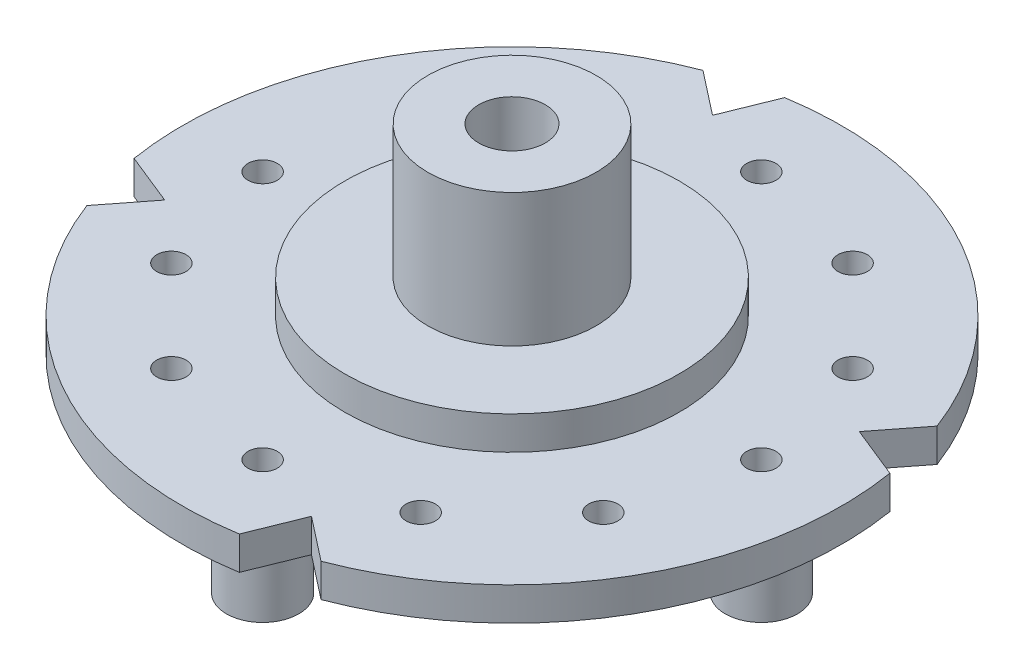
ISO-10303-21;
HEADER;
FILE_DESCRIPTION(('STEP AP214'),'2;1');
FILE_NAME('part.step','',(''),(''),'','','');
FILE_SCHEMA(('AUTOMOTIVE_DESIGN { 1 0 10303 214 1 1 1 1 }'));
ENDSEC;
DATA;
#1=APPLICATION_CONTEXT('core data for automotive mechanical design processes');
#2=APPLICATION_PROTOCOL_DEFINITION('international standard','automotive_design',2000,#1);
#3=PRODUCT_CONTEXT('',#1,'mechanical');
#4=PRODUCT('Part','Part','',(#3));
#5=PRODUCT_RELATED_PRODUCT_CATEGORY('part','',(#4));
#6=PRODUCT_DEFINITION_FORMATION('','',#4);
#7=PRODUCT_DEFINITION_CONTEXT('part definition',#1,'design');
#8=PRODUCT_DEFINITION('design','',#6,#7);
#9=PRODUCT_DEFINITION_SHAPE('','',#8);
#10=(LENGTH_UNIT() NAMED_UNIT(*) SI_UNIT(.MILLI.,.METRE.));
#11=(NAMED_UNIT(*) PLANE_ANGLE_UNIT() SI_UNIT($,.RADIAN.));
#12=(NAMED_UNIT(*) SI_UNIT($,.STERADIAN.) SOLID_ANGLE_UNIT());
#13=UNCERTAINTY_MEASURE_WITH_UNIT(LENGTH_MEASURE(1.E-05),#10,'distance_accuracy_value','');
#14=(GEOMETRIC_REPRESENTATION_CONTEXT(3) GLOBAL_UNCERTAINTY_ASSIGNED_CONTEXT((#13)) GLOBAL_UNIT_ASSIGNED_CONTEXT((#10,
#11,#12)) REPRESENTATION_CONTEXT('',''));
#15=CARTESIAN_POINT('',(0.,0.,0.));
#16=DIRECTION('',(0.,0.,1.));
#17=DIRECTION('',(1.,0.,0.));
#18=AXIS2_PLACEMENT_3D('',#15,#16,#17);
#19=CARTESIAN_POINT('',(0.,25.908,0.));
#20=DIRECTION('',(0.,1.,0.));
#21=DIRECTION('',(0.,0.,1.));
#22=AXIS2_PLACEMENT_3D('',#19,#20,#21);
#23=CYLINDRICAL_SURFACE('',#22,42.799);
#24=CARTESIAN_POINT('',(0.,4.318,0.));
#25=DIRECTION('',(0.,1.,0.));
#26=DIRECTION('',(0.,0.,1.));
#27=AXIS2_PLACEMENT_3D('',#24,#25,#26);
#28=CIRCLE('',#27,42.799);
#29=CARTESIAN_POINT('',(-40.0070336083831,4.318,15.2049880913371));
#30=VERTEX_POINT('',#29);
#31=CARTESIAN_POINT('',(6.83561085285415,4.318,42.2496014805861));
#32=VERTEX_POINT('',#31);
#33=EDGE_CURVE('E273',#30,#32,#28,.T.);
#34=ORIENTED_EDGE('',*,*,#33,.F.);
#35=DIRECTION('',(0.,-1.,0.));
#36=VECTOR('',#35,1.);
#37=CARTESIAN_POINT('',(-40.0070336083831,25.908,15.2049880913371));
#38=LINE('',#37,#36);
#39=CARTESIAN_POINT('',(-40.0070336083831,0.,15.2049880913371));
#40=VERTEX_POINT('',#39);
#41=EDGE_CURVE('E135',#30,#40,#38,.T.);
#42=ORIENTED_EDGE('',*,*,#41,.T.);
#43=CARTESIAN_POINT('',(0.,0.,0.));
#44=DIRECTION('',(0.,1.,0.));
#45=DIRECTION('',(0.,0.,1.));
#46=AXIS2_PLACEMENT_3D('',#43,#44,#45);
#47=CIRCLE('',#46,42.799);
#48=CARTESIAN_POINT('',(6.83561085285415,0.,42.2496014805861));
#49=VERTEX_POINT('',#48);
#50=EDGE_CURVE('E147',#40,#49,#47,.T.);
#51=ORIENTED_EDGE('',*,*,#50,.T.);
#52=DIRECTION('',(0.,-1.,0.));
#53=VECTOR('',#52,1.);
#54=CARTESIAN_POINT('',(6.83561085285415,25.908,42.2496014805861));
#55=LINE('',#54,#53);
#56=EDGE_CURVE('E142',#32,#49,#55,.T.);
#57=ORIENTED_EDGE('',*,*,#56,.F.);
#58=EDGE_LOOP('',(#34,#42,#51,#57));
#59=FACE_BOUND('',#58,.T.);
#60=ADVANCED_FACE('F35',(#59),#23,.T.);
#61=CARTESIAN_POINT('',(-15.2049880913371,0.,-40.0070336083831));
#62=VERTEX_POINT('',#61);
#63=CARTESIAN_POINT('',(-42.2496014805861,0.,6.83561085285415));
#64=VERTEX_POINT('',#63);
#65=EDGE_CURVE('E271',#62,#64,#47,.T.);
#66=ORIENTED_EDGE('',*,*,#65,.T.);
#67=DIRECTION('',(0.,-1.,0.));
#68=VECTOR('',#67,1.);
#69=CARTESIAN_POINT('',(-42.2496014805861,25.908,6.83561085285414));
#70=LINE('',#69,#68);
#71=CARTESIAN_POINT('',(-42.2496014805861,4.318,6.83561085285414));
#72=VERTEX_POINT('',#71);
#73=EDGE_CURVE('E60',#72,#64,#70,.T.);
#74=ORIENTED_EDGE('',*,*,#73,.F.);
#75=CARTESIAN_POINT('',(-15.2049880913371,4.318,-40.0070336083831));
#76=VERTEX_POINT('',#75);
#77=EDGE_CURVE('E276',#76,#72,#28,.T.);
#78=ORIENTED_EDGE('',*,*,#77,.F.);
#79=DIRECTION('',(0.,-1.,0.));
#80=VECTOR('',#79,1.);
#81=CARTESIAN_POINT('',(-15.2049880913371,25.908,-40.0070336083831));
#82=LINE('',#81,#80);
#83=EDGE_CURVE('E167',#76,#62,#82,.T.);
#84=ORIENTED_EDGE('',*,*,#83,.T.);
#85=EDGE_LOOP('',(#66,#74,#78,#84));
#86=FACE_BOUND('',#85,.T.);
#87=ADVANCED_FACE('F343',(#86),#23,.T.);
#88=CARTESIAN_POINT('',(40.0070336083831,4.318,-15.2049880913371));
#89=VERTEX_POINT('',#88);
#90=CARTESIAN_POINT('',(-6.83561085285415,4.318,-42.2496014805861));
#91=VERTEX_POINT('',#90);
#92=EDGE_CURVE('E376',#89,#91,#28,.T.);
#93=ORIENTED_EDGE('',*,*,#92,.F.);
#94=DIRECTION('',(0.,-1.,0.));
#95=VECTOR('',#94,1.);
#96=CARTESIAN_POINT('',(40.0070336083831,25.908,-15.2049880913371));
#97=LINE('',#96,#95);
#98=CARTESIAN_POINT('',(40.0070336083831,0.,-15.2049880913371));
#99=VERTEX_POINT('',#98);
#100=EDGE_CURVE('E155',#89,#99,#97,.T.);
#101=ORIENTED_EDGE('',*,*,#100,.T.);
#102=CARTESIAN_POINT('',(-6.83561085285415,0.,-42.2496014805861));
#103=VERTEX_POINT('',#102);
#104=EDGE_CURVE('E384',#99,#103,#47,.T.);
#105=ORIENTED_EDGE('',*,*,#104,.T.);
#106=DIRECTION('',(0.,-1.,0.));
#107=VECTOR('',#106,1.);
#108=CARTESIAN_POINT('',(-6.83561085285415,25.908,-42.2496014805861));
#109=LINE('',#108,#107);
#110=EDGE_CURVE('E180',#91,#103,#109,.T.);
#111=ORIENTED_EDGE('',*,*,#110,.F.);
#112=EDGE_LOOP('',(#93,#101,#105,#111));
#113=FACE_BOUND('',#112,.T.);
#114=ADVANCED_FACE('F350',(#113),#23,.T.);
#115=CARTESIAN_POINT('',(0.,25.908,0.));
#116=DIRECTION('',(0.,1.,0.));
#117=DIRECTION('',(0.,0.,1.));
#118=AXIS2_PLACEMENT_3D('',#115,#116,#117);
#119=CYLINDRICAL_SURFACE('',#118,4.318);
#120=CARTESIAN_POINT('',(0.,4.572,0.));
#121=DIRECTION('',(0.,1.,0.));
#122=DIRECTION('',(0.,0.,1.));
#123=AXIS2_PLACEMENT_3D('',#120,#121,#122);
#124=CIRCLE('',#123,4.318);
#125=CARTESIAN_POINT('',(0.,4.572,4.318));
#126=VERTEX_POINT('',#125);
#127=EDGE_CURVE('E267',#126,#126,#124,.T.);
#128=ORIENTED_EDGE('',*,*,#127,.F.);
#129=EDGE_LOOP('',(#128));
#130=FACE_BOUND('',#129,.T.);
#131=CARTESIAN_POINT('',(0.,25.908,0.));
#132=DIRECTION('',(0.,1.,0.));
#133=DIRECTION('',(0.,0.,1.));
#134=AXIS2_PLACEMENT_3D('',#131,#132,#133);
#135=CIRCLE('',#134,4.318);
#136=CARTESIAN_POINT('',(0.,25.908,4.318));
#137=VERTEX_POINT('',#136);
#138=EDGE_CURVE('E290',#137,#137,#135,.T.);
#139=ORIENTED_EDGE('',*,*,#138,.T.);
#140=EDGE_LOOP('',(#139));
#141=FACE_BOUND('',#140,.T.);
#142=ADVANCED_FACE('F37',(#130,#141),#119,.F.);
#143=CARTESIAN_POINT('',(0.,25.908,0.));
#144=DIRECTION('',(0.,-1.,0.));
#145=DIRECTION('',(0.,0.,-1.));
#146=AXIS2_PLACEMENT_3D('',#143,#144,#145);
#147=PLANE('',#146);
#148=ORIENTED_EDGE('',*,*,#138,.F.);
#149=EDGE_LOOP('',(#148));
#150=FACE_BOUND('',#149,.T.);
#151=CARTESIAN_POINT('',(0.,25.908,0.));
#152=DIRECTION('',(0.,1.,0.));
#153=DIRECTION('',(0.,0.,1.));
#154=AXIS2_PLACEMENT_3D('',#151,#152,#153);
#155=CIRCLE('',#154,10.922);
#156=CARTESIAN_POINT('',(0.,25.908,10.922));
#157=VERTEX_POINT('',#156);
#158=EDGE_CURVE('E287',#157,#157,#155,.T.);
#159=ORIENTED_EDGE('',*,*,#158,.T.);
#160=EDGE_LOOP('',(#159));
#161=FACE_BOUND('',#160,.T.);
#162=ADVANCED_FACE('F371',(#150,#161),#147,.F.);
#163=CARTESIAN_POINT('',(0.,25.908,0.));
#164=DIRECTION('',(0.,1.,0.));
#165=DIRECTION('',(0.,0.,1.));
#166=AXIS2_PLACEMENT_3D('',#163,#164,#165);
#167=CYLINDRICAL_SURFACE('',#166,10.922);
#168=ORIENTED_EDGE('',*,*,#158,.F.);
#169=EDGE_LOOP('',(#168));
#170=FACE_BOUND('',#169,.T.);
#171=CARTESIAN_POINT('',(0.,8.63599999999999,0.));
#172=DIRECTION('',(0.,1.,0.));
#173=DIRECTION('',(0.,0.,1.));
#174=AXIS2_PLACEMENT_3D('',#171,#172,#173);
#175=CIRCLE('',#174,10.922);
#176=CARTESIAN_POINT('',(0.,8.63599999999999,10.922));
#177=VERTEX_POINT('',#176);
#178=EDGE_CURVE('E284',#177,#177,#175,.T.);
#179=ORIENTED_EDGE('',*,*,#178,.T.);
#180=EDGE_LOOP('',(#179));
#181=FACE_BOUND('',#180,.T.);
#182=ADVANCED_FACE('F465',(#170,#181),#167,.T.);
#183=CARTESIAN_POINT('',(0.,8.63599999999999,0.));
#184=DIRECTION('',(0.,-1.,0.));
#185=DIRECTION('',(0.,0.,-1.));
#186=AXIS2_PLACEMENT_3D('',#183,#184,#185);
#187=PLANE('',#186);
#188=ORIENTED_EDGE('',*,*,#178,.F.);
#189=EDGE_LOOP('',(#188));
#190=FACE_BOUND('',#189,.T.);
#191=CARTESIAN_POINT('',(0.,8.63599999999999,0.));
#192=DIRECTION('',(0.,1.,0.));
#193=DIRECTION('',(0.,0.,1.));
#194=AXIS2_PLACEMENT_3D('',#191,#192,#193);
#195=CIRCLE('',#194,21.717);
#196=CARTESIAN_POINT('',(0.,8.63599999999999,21.717));
#197=VERTEX_POINT('',#196);
#198=EDGE_CURVE('E281',#197,#197,#195,.T.);
#199=ORIENTED_EDGE('',*,*,#198,.T.);
#200=EDGE_LOOP('',(#199));
#201=FACE_BOUND('',#200,.T.);
#202=ADVANCED_FACE('F459',(#190,#201),#187,.F.);
#203=CARTESIAN_POINT('',(0.,25.908,0.));
#204=DIRECTION('',(0.,1.,0.));
#205=DIRECTION('',(0.,0.,1.));
#206=AXIS2_PLACEMENT_3D('',#203,#204,#205);
#207=CYLINDRICAL_SURFACE('',#206,21.717);
#208=ORIENTED_EDGE('',*,*,#198,.F.);
#209=EDGE_LOOP('',(#208));
#210=FACE_BOUND('',#209,.T.);
#211=CARTESIAN_POINT('',(0.,4.318,0.));
#212=DIRECTION('',(0.,1.,0.));
#213=DIRECTION('',(0.,0.,1.));
#214=AXIS2_PLACEMENT_3D('',#211,#212,#213);
#215=CIRCLE('',#214,21.717);
#216=CARTESIAN_POINT('',(0.,4.318,21.717));
#217=VERTEX_POINT('',#216);
#218=EDGE_CURVE('E278',#217,#217,#215,.T.);
#219=ORIENTED_EDGE('',*,*,#218,.T.);
#220=EDGE_LOOP('',(#219));
#221=FACE_BOUND('',#220,.T.);
#222=ADVANCED_FACE('F363',(#210,#221),#207,.T.);
#223=CARTESIAN_POINT('',(0.,4.318,0.));
#224=DIRECTION('',(0.,-1.,0.));
#225=DIRECTION('',(0.,0.,-1.));
#226=AXIS2_PLACEMENT_3D('',#223,#224,#225);
#227=PLANE('',#226);
#228=CARTESIAN_POINT('',(-32.385,4.318,0.));
#229=DIRECTION('',(0.,1.,0.));
#230=DIRECTION('',(0.,0.,1.));
#231=AXIS2_PLACEMENT_3D('',#228,#229,#230);
#232=CIRCLE('',#231,1.905);
#233=CARTESIAN_POINT('',(-32.385,4.318,1.905));
#234=VERTEX_POINT('',#233);
#235=EDGE_CURVE('E211',#234,#234,#232,.T.);
#236=ORIENTED_EDGE('',*,*,#235,.F.);
#237=EDGE_LOOP('',(#236));
#238=FACE_BOUND('',#237,.T.);
#239=CARTESIAN_POINT('',(-28.046232701559,4.318,16.1925000000002));
#240=DIRECTION('',(0.,1.,0.));
#241=DIRECTION('',(0.,0.,1.));
#242=AXIS2_PLACEMENT_3D('',#239,#240,#241);
#243=CIRCLE('',#242,1.90499999999977);
#244=CARTESIAN_POINT('',(-28.046232701559,4.318,18.0975));
#245=VERTEX_POINT('',#244);
#246=EDGE_CURVE('E206',#245,#245,#243,.T.);
#247=ORIENTED_EDGE('',*,*,#246,.F.);
#248=EDGE_LOOP('',(#247));
#249=FACE_BOUND('',#248,.T.);
#250=CARTESIAN_POINT('',(-16.1924999999998,4.318,28.0462327015594));
#251=DIRECTION('',(0.,1.,0.));
#252=DIRECTION('',(0.,0.,1.));
#253=AXIS2_PLACEMENT_3D('',#250,#251,#252);
#254=CIRCLE('',#253,1.905);
#255=CARTESIAN_POINT('',(-16.1924999999998,4.318,29.9512327015594));
#256=VERTEX_POINT('',#255);
#257=EDGE_CURVE('E222',#256,#256,#254,.T.);
#258=ORIENTED_EDGE('',*,*,#257,.F.);
#259=EDGE_LOOP('',(#258));
#260=FACE_BOUND('',#259,.T.);
#261=CARTESIAN_POINT('',(4.0766001685455E-13,4.318,32.3850000000004));
#262=DIRECTION('',(0.,1.,0.));
#263=DIRECTION('',(0.,0.,1.));
#264=AXIS2_PLACEMENT_3D('',#261,#262,#263);
#265=CIRCLE('',#264,1.90499999999981);
#266=CARTESIAN_POINT('',(4.0766001685455E-13,4.318,34.2900000000002));
#267=VERTEX_POINT('',#266);
#268=EDGE_CURVE('E219',#267,#267,#265,.T.);
#269=ORIENTED_EDGE('',*,*,#268,.F.);
#270=EDGE_LOOP('',(#269));
#271=FACE_BOUND('',#270,.T.);
#272=CARTESIAN_POINT('',(-28.046232701559,4.318,-16.1925000000002));
#273=DIRECTION('',(0.,1.,0.));
#274=DIRECTION('',(0.,0.,1.));
#275=AXIS2_PLACEMENT_3D('',#272,#273,#274);
#276=CIRCLE('',#275,1.905);
#277=CARTESIAN_POINT('',(-28.046232701559,4.318,-14.2875000000002));
#278=VERTEX_POINT('',#277);
#279=EDGE_CURVE('E214',#278,#278,#276,.T.);
#280=ORIENTED_EDGE('',*,*,#279,.F.);
#281=EDGE_LOOP('',(#280));
#282=FACE_BOUND('',#281,.T.);
#283=CARTESIAN_POINT('',(-16.1924999999998,4.318,-28.0462327015594));
#284=DIRECTION('',(0.,1.,0.));
#285=DIRECTION('',(0.,0.,1.));
#286=AXIS2_PLACEMENT_3D('',#283,#284,#285);
#287=CIRCLE('',#286,1.905);
#288=CARTESIAN_POINT('',(-16.1924999999998,4.318,-26.1412327015594));
#289=VERTEX_POINT('',#288);
#290=EDGE_CURVE('E244',#289,#289,#287,.T.);
#291=ORIENTED_EDGE('',*,*,#290,.F.);
#292=EDGE_LOOP('',(#291));
#293=FACE_BOUND('',#292,.T.);
#294=CARTESIAN_POINT('',(4.00721122950642E-13,4.318,-32.3850000000004));
#295=DIRECTION('',(0.,1.,0.));
#296=DIRECTION('',(0.,0.,1.));
#297=AXIS2_PLACEMENT_3D('',#294,#295,#296);
#298=CIRCLE('',#297,1.905);
#299=CARTESIAN_POINT('',(4.00721122950642E-13,4.318,-30.4800000000004));
#300=VERTEX_POINT('',#299);
#301=EDGE_CURVE('E250',#300,#300,#298,.T.);
#302=ORIENTED_EDGE('',*,*,#301,.F.);
#303=EDGE_LOOP('',(#302));
#304=FACE_BOUND('',#303,.T.);
#305=CARTESIAN_POINT('',(16.1925000000006,4.318,-28.0462327015594));
#306=DIRECTION('',(0.,1.,0.));
#307=DIRECTION('',(0.,0.,1.));
#308=AXIS2_PLACEMENT_3D('',#305,#306,#307);
#309=CIRCLE('',#308,1.905);
#310=CARTESIAN_POINT('',(16.1925000000006,4.318,-26.1412327015594));
#311=VERTEX_POINT('',#310);
#312=EDGE_CURVE('E230',#311,#311,#309,.T.);
#313=ORIENTED_EDGE('',*,*,#312,.F.);
#314=EDGE_LOOP('',(#313));
#315=FACE_BOUND('',#314,.T.);
#316=CARTESIAN_POINT('',(28.0462327015598,4.318,-16.1925000000002));
#317=DIRECTION('',(0.,1.,0.));
#318=DIRECTION('',(0.,0.,1.));
#319=AXIS2_PLACEMENT_3D('',#316,#317,#318);
#320=CIRCLE('',#319,1.905);
#321=CARTESIAN_POINT('',(28.0462327015598,4.318,-14.2875000000002));
#322=VERTEX_POINT('',#321);
#323=EDGE_CURVE('E227',#322,#322,#320,.T.);
#324=ORIENTED_EDGE('',*,*,#323,.F.);
#325=EDGE_LOOP('',(#324));
#326=FACE_BOUND('',#325,.T.);
#327=CARTESIAN_POINT('',(32.3850000000008,4.318,0.));
#328=DIRECTION('',(0.,1.,0.));
#329=DIRECTION('',(0.,0.,1.));
#330=AXIS2_PLACEMENT_3D('',#327,#328,#329);
#331=CIRCLE('',#330,1.905);
#332=CARTESIAN_POINT('',(32.3850000000008,4.318,1.905));
#333=VERTEX_POINT('',#332);
#334=EDGE_CURVE('E234',#333,#333,#331,.T.);
#335=ORIENTED_EDGE('',*,*,#334,.F.);
#336=EDGE_LOOP('',(#335));
#337=FACE_BOUND('',#336,.T.);
#338=CARTESIAN_POINT('',(28.0462327015598,4.318,16.1925000000002));
#339=DIRECTION('',(0.,1.,0.));
#340=DIRECTION('',(0.,0.,1.));
#341=AXIS2_PLACEMENT_3D('',#338,#339,#340);
#342=CIRCLE('',#341,1.905);
#343=CARTESIAN_POINT('',(28.0462327015598,4.318,18.0975000000002));
#344=VERTEX_POINT('',#343);
#345=EDGE_CURVE('E237',#344,#344,#342,.T.);
#346=ORIENTED_EDGE('',*,*,#345,.F.);
#347=EDGE_LOOP('',(#346));
#348=FACE_BOUND('',#347,.T.);
#349=CARTESIAN_POINT('',(16.1925000000006,4.318,28.0462327015594));
#350=DIRECTION('',(0.,1.,0.));
#351=DIRECTION('',(0.,0.,1.));
#352=AXIS2_PLACEMENT_3D('',#349,#350,#351);
#353=CIRCLE('',#352,1.905);
#354=CARTESIAN_POINT('',(16.1925000000006,4.318,29.9512327015594));
#355=VERTEX_POINT('',#354);
#356=EDGE_CURVE('E218',#355,#355,#353,.T.);
#357=ORIENTED_EDGE('',*,*,#356,.F.);
#358=EDGE_LOOP('',(#357));
#359=FACE_BOUND('',#358,.T.);
#360=ORIENTED_EDGE('',*,*,#218,.F.);
#361=EDGE_LOOP('',(#360));
#362=FACE_BOUND('',#361,.T.);
#363=DIRECTION('',(0.927183854566789,0.,0.374606593415907));
#364=VECTOR('',#363,1.);
#365=CARTESIAN_POINT('',(-8.30309794164443,4.318,20.5508885579923));
#366=LINE('',#365,#364);
#367=CARTESIAN_POINT('',(-35.5750481822264,4.318,9.53230543112598));
#368=VERTEX_POINT('',#367);
#369=EDGE_CURVE('E203',#72,#368,#366,.T.);
#370=ORIENTED_EDGE('',*,*,#369,.T.);
#371=DIRECTION('',(-0.615661475325655,0.,0.788010753606724));
#372=VECTOR('',#371,1.);
#373=CARTESIAN_POINT('',(-17.4661380265707,4.318,-13.646042590742));
#374=LINE('',#373,#372);
#375=EDGE_CURVE('E133',#368,#30,#374,.T.);
#376=ORIENTED_EDGE('',*,*,#375,.T.);
#377=ORIENTED_EDGE('',*,*,#33,.T.);
#378=DIRECTION('',(0.374606593415907,0.,-0.92718385456679));
#379=VECTOR('',#378,1.);
#380=CARTESIAN_POINT('',(20.5508885579923,4.318,8.3030979416444));
#381=LINE('',#380,#379);
#382=CARTESIAN_POINT('',(9.53230543112599,4.318,35.5750481822263));
#383=VERTEX_POINT('',#382);
#384=EDGE_CURVE('E200',#32,#383,#381,.T.);
#385=ORIENTED_EDGE('',*,*,#384,.T.);
#386=DIRECTION('',(0.788010753606723,0.,0.615661475325657));
#387=VECTOR('',#386,1.);
#388=CARTESIAN_POINT('',(-13.646042590742,4.318,17.4661380265706));
#389=LINE('',#388,#387);
#390=CARTESIAN_POINT('',(15.2049880913371,4.318,40.0070336083831));
#391=VERTEX_POINT('',#390);
#392=EDGE_CURVE('E197',#383,#391,#389,.T.);
#393=ORIENTED_EDGE('',*,*,#392,.T.);
#394=CARTESIAN_POINT('',(42.2496014805861,4.318,-6.83561085285415));
#395=VERTEX_POINT('',#394);
#396=EDGE_CURVE('E277',#391,#395,#28,.T.);
#397=ORIENTED_EDGE('',*,*,#396,.T.);
#398=DIRECTION('',(-0.92718385456679,0.,-0.374606593415907));
#399=VECTOR('',#398,1.);
#400=CARTESIAN_POINT('',(8.30309794164442,4.318,-20.5508885579923));
#401=LINE('',#400,#399);
#402=CARTESIAN_POINT('',(35.5750481822263,4.318,-9.53230543112599));
#403=VERTEX_POINT('',#402);
#404=EDGE_CURVE('E191',#395,#403,#401,.T.);
#405=ORIENTED_EDGE('',*,*,#404,.T.);
#406=DIRECTION('',(0.615661475325657,0.,-0.788010753606723));
#407=VECTOR('',#406,1.);
#408=CARTESIAN_POINT('',(17.4661380265706,4.318,13.646042590742));
#409=LINE('',#408,#407);
#410=EDGE_CURVE('E194',#403,#89,#409,.T.);
#411=ORIENTED_EDGE('',*,*,#410,.T.);
#412=ORIENTED_EDGE('',*,*,#92,.T.);
#413=DIRECTION('',(-0.374606593415907,0.,0.92718385456679));
#414=VECTOR('',#413,1.);
#415=CARTESIAN_POINT('',(-20.5508885579923,4.318,-8.30309794164441));
#416=LINE('',#415,#414);
#417=CARTESIAN_POINT('',(-9.53230543112599,4.318,-35.5750481822264));
#418=VERTEX_POINT('',#417);
#419=EDGE_CURVE('E151',#91,#418,#416,.T.);
#420=ORIENTED_EDGE('',*,*,#419,.T.);
#421=DIRECTION('',(-0.788010753606724,0.,-0.615661475325656));
#422=VECTOR('',#421,1.);
#423=CARTESIAN_POINT('',(13.646042590742,4.318,-17.4661380265706));
#424=LINE('',#423,#422);
#425=EDGE_CURVE('E188',#418,#76,#424,.T.);
#426=ORIENTED_EDGE('',*,*,#425,.T.);
#427=ORIENTED_EDGE('',*,*,#77,.T.);
#428=EDGE_LOOP('',(#370,#376,#377,#385,#393,#397,#405,#411,#412,#420,#426,#427));
#429=FACE_BOUND('',#428,.T.);
#430=ADVANCED_FACE('F356',(#238,#249,#260,#271,#282,#293,#304,#315,#326,#337,#348,#359,#362,
#429),#227,.F.);
#431=ORIENTED_EDGE('',*,*,#396,.F.);
#432=DIRECTION('',(0.,-1.,0.));
#433=VECTOR('',#432,1.);
#434=CARTESIAN_POINT('',(15.2049880913371,25.908,40.0070336083831));
#435=LINE('',#434,#433);
#436=CARTESIAN_POINT('',(15.2049880913371,0.,40.0070336083831));
#437=VERTEX_POINT('',#436);
#438=EDGE_CURVE('E159',#391,#437,#435,.T.);
#439=ORIENTED_EDGE('',*,*,#438,.T.);
#440=CARTESIAN_POINT('',(42.2496014805861,0.,-6.83561085285416));
#441=VERTEX_POINT('',#440);
#442=EDGE_CURVE('E272',#437,#441,#47,.T.);
#443=ORIENTED_EDGE('',*,*,#442,.T.);
#444=DIRECTION('',(0.,-1.,0.));
#445=VECTOR('',#444,1.);
#446=CARTESIAN_POINT('',(42.2496014805861,25.908,-6.83561085285415));
#447=LINE('',#446,#445);
#448=EDGE_CURVE('E169',#395,#441,#447,.T.);
#449=ORIENTED_EDGE('',*,*,#448,.F.);
#450=EDGE_LOOP('',(#431,#439,#443,#449));
#451=FACE_BOUND('',#450,.T.);
#452=ADVANCED_FACE('F346',(#451),#23,.T.);
#453=CARTESIAN_POINT('',(0.,0.,0.));
#454=DIRECTION('',(0.,1.,0.));
#455=DIRECTION('',(0.,0.,1.));
#456=AXIS2_PLACEMENT_3D('',#453,#454,#455);
#457=PLANE('',#456);
#458=CARTESIAN_POINT('',(-28.046232701559,0.,16.1925000000002));
#459=DIRECTION('',(0.,1.,0.));
#460=DIRECTION('',(0.,0.,1.));
#461=AXIS2_PLACEMENT_3D('',#458,#459,#460);
#462=CIRCLE('',#461,1.90499999999977);
#463=CARTESIAN_POINT('',(-28.046232701559,0.,18.0975));
#464=VERTEX_POINT('',#463);
#465=EDGE_CURVE('E39',#464,#464,#462,.T.);
#466=ORIENTED_EDGE('',*,*,#465,.T.);
#467=EDGE_LOOP('',(#466));
#468=FACE_BOUND('',#467,.T.);
#469=CARTESIAN_POINT('',(-16.1924999999998,0.,28.0462327015594));
#470=DIRECTION('',(0.,1.,0.));
#471=DIRECTION('',(0.,0.,1.));
#472=AXIS2_PLACEMENT_3D('',#469,#470,#471);
#473=CIRCLE('',#472,1.905);
#474=CARTESIAN_POINT('',(-16.1924999999998,0.,29.9512327015594));
#475=VERTEX_POINT('',#474);
#476=EDGE_CURVE('E317',#475,#475,#473,.T.);
#477=ORIENTED_EDGE('',*,*,#476,.T.);
#478=EDGE_LOOP('',(#477));
#479=FACE_BOUND('',#478,.T.);
#480=CARTESIAN_POINT('',(-28.046232701559,0.,-16.1925000000002));
#481=DIRECTION('',(0.,1.,0.));
#482=DIRECTION('',(0.,0.,1.));
#483=AXIS2_PLACEMENT_3D('',#480,#481,#482);
#484=CIRCLE('',#483,1.905);
#485=CARTESIAN_POINT('',(-28.046232701559,0.,-14.2875000000002));
#486=VERTEX_POINT('',#485);
#487=EDGE_CURVE('E315',#486,#486,#484,.T.);
#488=ORIENTED_EDGE('',*,*,#487,.T.);
#489=EDGE_LOOP('',(#488));
#490=FACE_BOUND('',#489,.T.);
#491=CARTESIAN_POINT('',(-16.1924999999998,0.,-28.0462327015594));
#492=DIRECTION('',(0.,1.,0.));
#493=DIRECTION('',(0.,0.,1.));
#494=AXIS2_PLACEMENT_3D('',#491,#492,#493);
#495=CIRCLE('',#494,1.905);
#496=CARTESIAN_POINT('',(-16.1924999999998,0.,-26.1412327015594));
#497=VERTEX_POINT('',#496);
#498=EDGE_CURVE('E312',#497,#497,#495,.T.);
#499=ORIENTED_EDGE('',*,*,#498,.T.);
#500=EDGE_LOOP('',(#499));
#501=FACE_BOUND('',#500,.T.);
#502=CARTESIAN_POINT('',(16.1925000000006,0.,-28.0462327015594));
#503=DIRECTION('',(0.,1.,0.));
#504=DIRECTION('',(0.,0.,1.));
#505=AXIS2_PLACEMENT_3D('',#502,#503,#504);
#506=CIRCLE('',#505,1.905);
#507=CARTESIAN_POINT('',(16.1925000000006,0.,-26.1412327015594));
#508=VERTEX_POINT('',#507);
#509=EDGE_CURVE('E309',#508,#508,#506,.T.);
#510=ORIENTED_EDGE('',*,*,#509,.T.);
#511=EDGE_LOOP('',(#510));
#512=FACE_BOUND('',#511,.T.);
#513=CARTESIAN_POINT('',(28.0462327015598,0.,-16.1925000000002));
#514=DIRECTION('',(0.,1.,0.));
#515=DIRECTION('',(0.,0.,1.));
#516=AXIS2_PLACEMENT_3D('',#513,#514,#515);
#517=CIRCLE('',#516,1.905);
#518=CARTESIAN_POINT('',(28.0462327015598,0.,-14.2875000000002));
#519=VERTEX_POINT('',#518);
#520=EDGE_CURVE('E306',#519,#519,#517,.T.);
#521=ORIENTED_EDGE('',*,*,#520,.T.);
#522=EDGE_LOOP('',(#521));
#523=FACE_BOUND('',#522,.T.);
#524=CARTESIAN_POINT('',(28.0462327015598,0.,16.1925000000002));
#525=DIRECTION('',(0.,1.,0.));
#526=DIRECTION('',(0.,0.,1.));
#527=AXIS2_PLACEMENT_3D('',#524,#525,#526);
#528=CIRCLE('',#527,1.905);
#529=CARTESIAN_POINT('',(28.0462327015598,0.,18.0975000000002));
#530=VERTEX_POINT('',#529);
#531=EDGE_CURVE('E303',#530,#530,#528,.T.);
#532=ORIENTED_EDGE('',*,*,#531,.T.);
#533=EDGE_LOOP('',(#532));
#534=FACE_BOUND('',#533,.T.);
#535=CARTESIAN_POINT('',(16.1925000000006,0.,28.0462327015594));
#536=DIRECTION('',(0.,1.,0.));
#537=DIRECTION('',(0.,0.,1.));
#538=AXIS2_PLACEMENT_3D('',#535,#536,#537);
#539=CIRCLE('',#538,1.905);
#540=CARTESIAN_POINT('',(16.1925000000006,0.,29.9512327015594));
#541=VERTEX_POINT('',#540);
#542=EDGE_CURVE('E210',#541,#541,#539,.T.);
#543=ORIENTED_EDGE('',*,*,#542,.T.);
#544=EDGE_LOOP('',(#543));
#545=FACE_BOUND('',#544,.T.);
#546=CARTESIAN_POINT('',(-32.3849999999991,0.,-9.20437059903634E-13));
#547=DIRECTION('',(0.,1.,0.));
#548=DIRECTION('',(0.,0.,1.));
#549=AXIS2_PLACEMENT_3D('',#546,#547,#548);
#550=CIRCLE('',#549,4.69900000000147);
#551=CARTESIAN_POINT('',(-32.3849999999991,0.,4.69900000000055));
#552=VERTEX_POINT('',#551);
#553=EDGE_CURVE('E11',#552,#552,#550,.F.);
#554=ORIENTED_EDGE('',*,*,#553,.F.);
#555=EDGE_LOOP('',(#554));
#556=FACE_BOUND('',#555,.T.);
#557=CARTESIAN_POINT('',(1.83294208248919E-12,0.,-32.385));
#558=DIRECTION('',(0.,1.,0.));
#559=DIRECTION('',(0.,0.,1.));
#560=AXIS2_PLACEMENT_3D('',#557,#558,#559);
#561=CIRCLE('',#560,4.69900000000197);
#562=CARTESIAN_POINT('',(1.83294208248919E-12,0.,-27.685999999998));
#563=VERTEX_POINT('',#562);
#564=EDGE_CURVE('E44',#563,#563,#561,.F.);
#565=ORIENTED_EDGE('',*,*,#564,.F.);
#566=EDGE_LOOP('',(#565));
#567=FACE_BOUND('',#566,.T.);
#568=CARTESIAN_POINT('',(32.3850000000009,0.,9.16471041244595E-13));
#569=DIRECTION('',(0.,1.,0.));
#570=DIRECTION('',(0.,0.,1.));
#571=AXIS2_PLACEMENT_3D('',#568,#569,#570);
#572=CIRCLE('',#571,4.69900000000072);
#573=CARTESIAN_POINT('',(32.3850000000009,0.,4.69900000000164));
#574=VERTEX_POINT('',#573);
#575=EDGE_CURVE('E296',#574,#574,#572,.F.);
#576=ORIENTED_EDGE('',*,*,#575,.F.);
#577=EDGE_LOOP('',(#576));
#578=FACE_BOUND('',#577,.T.);
#579=CARTESIAN_POINT('',(0.,0.,32.385));
#580=DIRECTION('',(0.,1.,0.));
#581=DIRECTION('',(0.,0.,1.));
#582=AXIS2_PLACEMENT_3D('',#579,#580,#581);
#583=CIRCLE('',#582,4.699);
#584=CARTESIAN_POINT('',(0.,0.,37.084));
#585=VERTEX_POINT('',#584);
#586=EDGE_CURVE('E293',#585,#585,#583,.F.);
#587=ORIENTED_EDGE('',*,*,#586,.F.);
#588=EDGE_LOOP('',(#587));
#589=FACE_BOUND('',#588,.T.);
#590=ORIENTED_EDGE('',*,*,#50,.F.);
#591=DIRECTION('',(-0.615661475325655,0.,0.788010753606724));
#592=VECTOR('',#591,1.);
#593=CARTESIAN_POINT('',(-17.4661380265707,0.,-13.646042590742));
#594=LINE('',#593,#592);
#595=CARTESIAN_POINT('',(-35.5750481822264,0.,9.53230543112598));
#596=VERTEX_POINT('',#595);
#597=EDGE_CURVE('E130',#596,#40,#594,.T.);
#598=ORIENTED_EDGE('',*,*,#597,.F.);
#599=DIRECTION('',(0.927183854566789,0.,0.374606593415907));
#600=VECTOR('',#599,1.);
#601=CARTESIAN_POINT('',(-8.30309794164443,0.,20.5508885579923));
#602=LINE('',#601,#600);
#603=EDGE_CURVE('E137',#64,#596,#602,.T.);
#604=ORIENTED_EDGE('',*,*,#603,.F.);
#605=ORIENTED_EDGE('',*,*,#65,.F.);
#606=DIRECTION('',(-0.788010753606724,0.,-0.615661475325656));
#607=VECTOR('',#606,1.);
#608=CARTESIAN_POINT('',(13.646042590742,0.,-17.4661380265706));
#609=LINE('',#608,#607);
#610=CARTESIAN_POINT('',(-9.53230543112599,0.,-35.5750481822264));
#611=VERTEX_POINT('',#610);
#612=EDGE_CURVE('E178',#611,#62,#609,.T.);
#613=ORIENTED_EDGE('',*,*,#612,.F.);
#614=DIRECTION('',(-0.374606593415907,0.,0.92718385456679));
#615=VECTOR('',#614,1.);
#616=CARTESIAN_POINT('',(-20.5508885579923,0.,-8.30309794164441));
#617=LINE('',#616,#615);
#618=EDGE_CURVE('E175',#103,#611,#617,.T.);
#619=ORIENTED_EDGE('',*,*,#618,.F.);
#620=ORIENTED_EDGE('',*,*,#104,.F.);
#621=DIRECTION('',(0.615661475325657,0.,-0.788010753606723));
#622=VECTOR('',#621,1.);
#623=CARTESIAN_POINT('',(17.4661380265706,0.,13.646042590742));
#624=LINE('',#623,#622);
#625=CARTESIAN_POINT('',(35.5750481822263,0.,-9.53230543112599));
#626=VERTEX_POINT('',#625);
#627=EDGE_CURVE('E166',#626,#99,#624,.T.);
#628=ORIENTED_EDGE('',*,*,#627,.F.);
#629=DIRECTION('',(-0.92718385456679,0.,-0.374606593415907));
#630=VECTOR('',#629,1.);
#631=CARTESIAN_POINT('',(8.30309794164442,0.,-20.5508885579923));
#632=LINE('',#631,#630);
#633=EDGE_CURVE('E163',#441,#626,#632,.T.);
#634=ORIENTED_EDGE('',*,*,#633,.F.);
#635=ORIENTED_EDGE('',*,*,#442,.F.);
#636=DIRECTION('',(0.788010753606723,0.,0.615661475325657));
#637=VECTOR('',#636,1.);
#638=CARTESIAN_POINT('',(-13.6460425907419,0.,17.4661380265706));
#639=LINE('',#638,#637);
#640=CARTESIAN_POINT('',(9.53230543112599,0.,35.5750481822263));
#641=VERTEX_POINT('',#640);
#642=EDGE_CURVE('E154',#641,#437,#639,.T.);
#643=ORIENTED_EDGE('',*,*,#642,.F.);
#644=DIRECTION('',(0.374606593415907,0.,-0.92718385456679));
#645=VECTOR('',#644,1.);
#646=CARTESIAN_POINT('',(20.5508885579923,0.,8.3030979416444));
#647=LINE('',#646,#645);
#648=EDGE_CURVE('E52',#49,#641,#647,.T.);
#649=ORIENTED_EDGE('',*,*,#648,.F.);
#650=EDGE_LOOP('',(#590,#598,#604,#605,#613,#619,#620,#628,#634,#635,#643,#649));
#651=FACE_BOUND('',#650,.T.);
#652=ADVANCED_FACE('F145',(#468,#479,#490,#501,#512,#523,#534,#545,#556,#567,#578,#589,#651),
#457,.F.);
#653=CARTESIAN_POINT('',(0.,4.572,0.));
#654=DIRECTION('',(0.,1.,0.));
#655=DIRECTION('',(0.,0.,1.));
#656=AXIS2_PLACEMENT_3D('',#653,#654,#655);
#657=PLANE('',#656);
#658=ORIENTED_EDGE('',*,*,#127,.T.);
#659=EDGE_LOOP('',(#658));
#660=FACE_BOUND('',#659,.T.);
#661=ADVANCED_FACE('F362',(#660),#657,.T.);
#662=CARTESIAN_POINT('',(0.,-10.668,32.385));
#663=DIRECTION('',(0.,1.,0.));
#664=DIRECTION('',(0.,0.,1.));
#665=AXIS2_PLACEMENT_3D('',#662,#663,#664);
#666=CYLINDRICAL_SURFACE('',#665,4.699);
#667=CARTESIAN_POINT('',(0.,-10.668,32.385));
#668=DIRECTION('',(0.,-1.,0.));
#669=DIRECTION('',(0.,0.,-1.));
#670=AXIS2_PLACEMENT_3D('',#667,#668,#669);
#671=CIRCLE('',#670,4.699);
#672=CARTESIAN_POINT('',(0.,-10.668,27.686));
#673=VERTEX_POINT('',#672);
#674=EDGE_CURVE('E264',#673,#673,#671,.T.);
#675=ORIENTED_EDGE('',*,*,#674,.F.);
#676=EDGE_LOOP('',(#675));
#677=FACE_BOUND('',#676,.T.);
#678=ORIENTED_EDGE('',*,*,#586,.T.);
#679=EDGE_LOOP('',(#678));
#680=FACE_BOUND('',#679,.T.);
#681=ADVANCED_FACE('F507',(#677,#680),#666,.T.);
#682=CARTESIAN_POINT('',(0.,-10.668,32.385));
#683=DIRECTION('',(0.,-1.,0.));
#684=DIRECTION('',(0.,0.,-1.));
#685=AXIS2_PLACEMENT_3D('',#682,#683,#684);
#686=PLANE('',#685);
#687=CARTESIAN_POINT('',(4.0766001685455E-13,-10.668,32.3850000000004));
#688=DIRECTION('',(0.,1.,0.));
#689=DIRECTION('',(0.,0.,1.));
#690=AXIS2_PLACEMENT_3D('',#687,#688,#689);
#691=CIRCLE('',#690,1.90499999999981);
#692=CARTESIAN_POINT('',(4.0766001685455E-13,-10.668,34.2900000000002));
#693=VERTEX_POINT('',#692);
#694=EDGE_CURVE('E215',#693,#693,#691,.T.);
#695=ORIENTED_EDGE('',*,*,#694,.T.);
#696=EDGE_LOOP('',(#695));
#697=FACE_BOUND('',#696,.T.);
#698=ORIENTED_EDGE('',*,*,#674,.T.);
#699=EDGE_LOOP('',(#698));
#700=FACE_BOUND('',#699,.T.);
#701=ADVANCED_FACE('F518',(#697,#700),#686,.T.);
#702=CARTESIAN_POINT('',(32.3850000000009,-10.668,9.16471041244595E-13));
#703=DIRECTION('',(0.,1.,0.));
#704=DIRECTION('',(0.,0.,1.));
#705=AXIS2_PLACEMENT_3D('',#702,#703,#704);
#706=CYLINDRICAL_SURFACE('',#705,4.69900000000072);
#707=CARTESIAN_POINT('',(32.3850000000009,-10.668,9.16471041244595E-13));
#708=DIRECTION('',(0.,-1.,0.));
#709=DIRECTION('',(0.,0.,-1.));
#710=AXIS2_PLACEMENT_3D('',#707,#708,#709);
#711=CIRCLE('',#710,4.69900000000072);
#712=CARTESIAN_POINT('',(32.3850000000009,-10.668,-4.6989999999998));
#713=VERTEX_POINT('',#712);
#714=EDGE_CURVE('E261',#713,#713,#711,.T.);
#715=ORIENTED_EDGE('',*,*,#714,.F.);
#716=EDGE_LOOP('',(#715));
#717=FACE_BOUND('',#716,.T.);
#718=ORIENTED_EDGE('',*,*,#575,.T.);
#719=EDGE_LOOP('',(#718));
#720=FACE_BOUND('',#719,.T.);
#721=ADVANCED_FACE('F526',(#717,#720),#706,.T.);
#722=CARTESIAN_POINT('',(32.3850000000009,-10.668,9.16471041244595E-13));
#723=DIRECTION('',(0.,-1.,0.));
#724=DIRECTION('',(0.,0.,-1.));
#725=AXIS2_PLACEMENT_3D('',#722,#723,#724);
#726=PLANE('',#725);
#727=CARTESIAN_POINT('',(32.3850000000008,-10.668,0.));
#728=DIRECTION('',(0.,1.,0.));
#729=DIRECTION('',(0.,0.,1.));
#730=AXIS2_PLACEMENT_3D('',#727,#728,#729);
#731=CIRCLE('',#730,1.905);
#732=CARTESIAN_POINT('',(32.3850000000008,-10.668,1.905));
#733=VERTEX_POINT('',#732);
#734=EDGE_CURVE('E231',#733,#733,#731,.T.);
#735=ORIENTED_EDGE('',*,*,#734,.T.);
#736=EDGE_LOOP('',(#735));
#737=FACE_BOUND('',#736,.T.);
#738=ORIENTED_EDGE('',*,*,#714,.T.);
#739=EDGE_LOOP('',(#738));
#740=FACE_BOUND('',#739,.T.);
#741=ADVANCED_FACE('F531',(#737,#740),#726,.T.);
#742=CARTESIAN_POINT('',(1.83294208248919E-12,-10.668,-32.385));
#743=DIRECTION('',(0.,1.,0.));
#744=DIRECTION('',(0.,0.,1.));
#745=AXIS2_PLACEMENT_3D('',#742,#743,#744);
#746=CYLINDRICAL_SURFACE('',#745,4.69900000000197);
#747=CARTESIAN_POINT('',(1.83294208248919E-12,-10.668,-32.385));
#748=DIRECTION('',(0.,-1.,0.));
#749=DIRECTION('',(0.,0.,-1.));
#750=AXIS2_PLACEMENT_3D('',#747,#748,#749);
#751=CIRCLE('',#750,4.69900000000197);
#752=CARTESIAN_POINT('',(1.83294208248919E-12,-10.668,-37.084000000002));
#753=VERTEX_POINT('',#752);
#754=EDGE_CURVE('E258',#753,#753,#751,.T.);
#755=ORIENTED_EDGE('',*,*,#754,.F.);
#756=EDGE_LOOP('',(#755));
#757=FACE_BOUND('',#756,.T.);
#758=ORIENTED_EDGE('',*,*,#564,.T.);
#759=EDGE_LOOP('',(#758));
#760=FACE_BOUND('',#759,.T.);
#761=ADVANCED_FACE('F539',(#757,#760),#746,.T.);
#762=CARTESIAN_POINT('',(1.83294208248919E-12,-10.668,-32.385));
#763=DIRECTION('',(0.,-1.,0.));
#764=DIRECTION('',(0.,0.,-1.));
#765=AXIS2_PLACEMENT_3D('',#762,#763,#764);
#766=PLANE('',#765);
#767=CARTESIAN_POINT('',(4.00721122950642E-13,-10.668,-32.3850000000004));
#768=DIRECTION('',(0.,1.,0.));
#769=DIRECTION('',(0.,0.,1.));
#770=AXIS2_PLACEMENT_3D('',#767,#768,#769);
#771=CIRCLE('',#770,1.905);
#772=CARTESIAN_POINT('',(4.00721122950642E-13,-10.668,-30.4800000000004));
#773=VERTEX_POINT('',#772);
#774=EDGE_CURVE('E247',#773,#773,#771,.T.);
#775=ORIENTED_EDGE('',*,*,#774,.T.);
#776=EDGE_LOOP('',(#775));
#777=FACE_BOUND('',#776,.T.);
#778=ORIENTED_EDGE('',*,*,#754,.T.);
#779=EDGE_LOOP('',(#778));
#780=FACE_BOUND('',#779,.T.);
#781=ADVANCED_FACE('F544',(#777,#780),#766,.T.);
#782=CARTESIAN_POINT('',(-32.3849999999991,-10.668,-9.20437059903634E-13));
#783=DIRECTION('',(0.,1.,0.));
#784=DIRECTION('',(0.,0.,1.));
#785=AXIS2_PLACEMENT_3D('',#782,#783,#784);
#786=CYLINDRICAL_SURFACE('',#785,4.69900000000147);
#787=CARTESIAN_POINT('',(-32.3849999999991,-10.668,-9.20437059903634E-13));
#788=DIRECTION('',(0.,-1.,0.));
#789=DIRECTION('',(0.,0.,-1.));
#790=AXIS2_PLACEMENT_3D('',#787,#788,#789);
#791=CIRCLE('',#790,4.69900000000147);
#792=CARTESIAN_POINT('',(-32.3849999999991,-10.668,-4.69900000000239));
#793=VERTEX_POINT('',#792);
#794=EDGE_CURVE('E255',#793,#793,#791,.T.);
#795=ORIENTED_EDGE('',*,*,#794,.F.);
#796=EDGE_LOOP('',(#795));
#797=FACE_BOUND('',#796,.T.);
#798=ORIENTED_EDGE('',*,*,#553,.T.);
#799=EDGE_LOOP('',(#798));
#800=FACE_BOUND('',#799,.T.);
#801=ADVANCED_FACE('F552',(#797,#800),#786,.T.);
#802=CARTESIAN_POINT('',(-32.3849999999991,-10.668,-9.20437059903634E-13));
#803=DIRECTION('',(0.,-1.,0.));
#804=DIRECTION('',(0.,0.,-1.));
#805=AXIS2_PLACEMENT_3D('',#802,#803,#804);
#806=PLANE('',#805);
#807=CARTESIAN_POINT('',(-32.385,-10.668,0.));
#808=DIRECTION('',(0.,1.,0.));
#809=DIRECTION('',(0.,0.,1.));
#810=AXIS2_PLACEMENT_3D('',#807,#808,#809);
#811=CIRCLE('',#810,1.905);
#812=CARTESIAN_POINT('',(-32.385,-10.668,1.905));
#813=VERTEX_POINT('',#812);
#814=EDGE_CURVE('E207',#813,#813,#811,.T.);
#815=ORIENTED_EDGE('',*,*,#814,.T.);
#816=EDGE_LOOP('',(#815));
#817=FACE_BOUND('',#816,.T.);
#818=ORIENTED_EDGE('',*,*,#794,.T.);
#819=EDGE_LOOP('',(#818));
#820=FACE_BOUND('',#819,.T.);
#821=ADVANCED_FACE('F419',(#817,#820),#806,.T.);
#822=CARTESIAN_POINT('',(-32.385,-10.668,0.));
#823=DIRECTION('',(0.,1.,0.));
#824=DIRECTION('',(0.,0.,1.));
#825=AXIS2_PLACEMENT_3D('',#822,#823,#824);
#826=CYLINDRICAL_SURFACE('',#825,1.905);
#827=ORIENTED_EDGE('',*,*,#814,.F.);
#828=EDGE_LOOP('',(#827));
#829=FACE_BOUND('',#828,.T.);
#830=ORIENTED_EDGE('',*,*,#235,.T.);
#831=EDGE_LOOP('',(#830));
#832=FACE_BOUND('',#831,.T.);
#833=ADVANCED_FACE('F415',(#829,#832),#826,.F.);
#834=CARTESIAN_POINT('',(4.00721122950642E-13,-10.668,-32.3850000000004));
#835=DIRECTION('',(0.,1.,0.));
#836=DIRECTION('',(0.,0.,1.));
#837=AXIS2_PLACEMENT_3D('',#834,#835,#836);
#838=CYLINDRICAL_SURFACE('',#837,1.905);
#839=ORIENTED_EDGE('',*,*,#774,.F.);
#840=EDGE_LOOP('',(#839));
#841=FACE_BOUND('',#840,.T.);
#842=ORIENTED_EDGE('',*,*,#301,.T.);
#843=EDGE_LOOP('',(#842));
#844=FACE_BOUND('',#843,.T.);
#845=ADVANCED_FACE('F418',(#841,#844),#838,.F.);
#846=CARTESIAN_POINT('',(32.3850000000008,-10.668,0.));
#847=DIRECTION('',(0.,1.,0.));
#848=DIRECTION('',(0.,0.,1.));
#849=AXIS2_PLACEMENT_3D('',#846,#847,#848);
#850=CYLINDRICAL_SURFACE('',#849,1.905);
#851=ORIENTED_EDGE('',*,*,#734,.F.);
#852=EDGE_LOOP('',(#851));
#853=FACE_BOUND('',#852,.T.);
#854=ORIENTED_EDGE('',*,*,#334,.T.);
#855=EDGE_LOOP('',(#854));
#856=FACE_BOUND('',#855,.T.);
#857=ADVANCED_FACE('F424',(#853,#856),#850,.F.);
#858=CARTESIAN_POINT('',(4.0766001685455E-13,-10.668,32.3850000000004));
#859=DIRECTION('',(0.,1.,0.));
#860=DIRECTION('',(0.,0.,1.));
#861=AXIS2_PLACEMENT_3D('',#858,#859,#860);
#862=CYLINDRICAL_SURFACE('',#861,1.90499999999981);
#863=ORIENTED_EDGE('',*,*,#694,.F.);
#864=EDGE_LOOP('',(#863));
#865=FACE_BOUND('',#864,.T.);
#866=ORIENTED_EDGE('',*,*,#268,.T.);
#867=EDGE_LOOP('',(#866));
#868=FACE_BOUND('',#867,.T.);
#869=ADVANCED_FACE('F421',(#865,#868),#862,.F.);
#870=CARTESIAN_POINT('',(16.1925000000006,-10.668,28.0462327015594));
#871=DIRECTION('',(0.,1.,0.));
#872=DIRECTION('',(0.,0.,1.));
#873=AXIS2_PLACEMENT_3D('',#870,#871,#872);
#874=CYLINDRICAL_SURFACE('',#873,1.905);
#875=ORIENTED_EDGE('',*,*,#356,.T.);
#876=EDGE_LOOP('',(#875));
#877=FACE_BOUND('',#876,.T.);
#878=ORIENTED_EDGE('',*,*,#542,.F.);
#879=EDGE_LOOP('',(#878));
#880=FACE_BOUND('',#879,.T.);
#881=ADVANCED_FACE('F423',(#877,#880),#874,.F.);
#882=CARTESIAN_POINT('',(28.0462327015598,-10.668,16.1925000000002));
#883=DIRECTION('',(0.,1.,0.));
#884=DIRECTION('',(0.,0.,1.));
#885=AXIS2_PLACEMENT_3D('',#882,#883,#884);
#886=CYLINDRICAL_SURFACE('',#885,1.905);
#887=ORIENTED_EDGE('',*,*,#345,.T.);
#888=EDGE_LOOP('',(#887));
#889=FACE_BOUND('',#888,.T.);
#890=ORIENTED_EDGE('',*,*,#531,.F.);
#891=EDGE_LOOP('',(#890));
#892=FACE_BOUND('',#891,.T.);
#893=ADVANCED_FACE('F430',(#889,#892),#886,.F.);
#894=CARTESIAN_POINT('',(28.0462327015598,-10.668,-16.1925000000002));
#895=DIRECTION('',(0.,1.,0.));
#896=DIRECTION('',(0.,0.,1.));
#897=AXIS2_PLACEMENT_3D('',#894,#895,#896);
#898=CYLINDRICAL_SURFACE('',#897,1.905);
#899=ORIENTED_EDGE('',*,*,#323,.T.);
#900=EDGE_LOOP('',(#899));
#901=FACE_BOUND('',#900,.T.);
#902=ORIENTED_EDGE('',*,*,#520,.F.);
#903=EDGE_LOOP('',(#902));
#904=FACE_BOUND('',#903,.T.);
#905=ADVANCED_FACE('F627',(#901,#904),#898,.F.);
#906=CARTESIAN_POINT('',(16.1925000000006,-10.668,-28.0462327015594));
#907=DIRECTION('',(0.,1.,0.));
#908=DIRECTION('',(0.,0.,1.));
#909=AXIS2_PLACEMENT_3D('',#906,#907,#908);
#910=CYLINDRICAL_SURFACE('',#909,1.905);
#911=ORIENTED_EDGE('',*,*,#312,.T.);
#912=EDGE_LOOP('',(#911));
#913=FACE_BOUND('',#912,.T.);
#914=ORIENTED_EDGE('',*,*,#509,.F.);
#915=EDGE_LOOP('',(#914));
#916=FACE_BOUND('',#915,.T.);
#917=ADVANCED_FACE('F637',(#913,#916),#910,.F.);
#918=CARTESIAN_POINT('',(-16.1924999999998,-10.668,-28.0462327015594));
#919=DIRECTION('',(0.,1.,0.));
#920=DIRECTION('',(0.,0.,1.));
#921=AXIS2_PLACEMENT_3D('',#918,#919,#920);
#922=CYLINDRICAL_SURFACE('',#921,1.905);
#923=ORIENTED_EDGE('',*,*,#290,.T.);
#924=EDGE_LOOP('',(#923));
#925=FACE_BOUND('',#924,.T.);
#926=ORIENTED_EDGE('',*,*,#498,.F.);
#927=EDGE_LOOP('',(#926));
#928=FACE_BOUND('',#927,.T.);
#929=ADVANCED_FACE('F646',(#925,#928),#922,.F.);
#930=CARTESIAN_POINT('',(-28.046232701559,-10.668,-16.1925000000002));
#931=DIRECTION('',(0.,1.,0.));
#932=DIRECTION('',(0.,0.,1.));
#933=AXIS2_PLACEMENT_3D('',#930,#931,#932);
#934=CYLINDRICAL_SURFACE('',#933,1.905);
#935=ORIENTED_EDGE('',*,*,#279,.T.);
#936=EDGE_LOOP('',(#935));
#937=FACE_BOUND('',#936,.T.);
#938=ORIENTED_EDGE('',*,*,#487,.F.);
#939=EDGE_LOOP('',(#938));
#940=FACE_BOUND('',#939,.T.);
#941=ADVANCED_FACE('F338',(#937,#940),#934,.F.);
#942=CARTESIAN_POINT('',(-16.1924999999998,-10.668,28.0462327015594));
#943=DIRECTION('',(0.,1.,0.));
#944=DIRECTION('',(0.,0.,1.));
#945=AXIS2_PLACEMENT_3D('',#942,#943,#944);
#946=CYLINDRICAL_SURFACE('',#945,1.905);
#947=ORIENTED_EDGE('',*,*,#257,.T.);
#948=EDGE_LOOP('',(#947));
#949=FACE_BOUND('',#948,.T.);
#950=ORIENTED_EDGE('',*,*,#476,.F.);
#951=EDGE_LOOP('',(#950));
#952=FACE_BOUND('',#951,.T.);
#953=ADVANCED_FACE('F328',(#949,#952),#946,.F.);
#954=CARTESIAN_POINT('',(-28.046232701559,-10.668,16.1925000000002));
#955=DIRECTION('',(0.,1.,0.));
#956=DIRECTION('',(0.,0.,1.));
#957=AXIS2_PLACEMENT_3D('',#954,#955,#956);
#958=CYLINDRICAL_SURFACE('',#957,1.90499999999977);
#959=ORIENTED_EDGE('',*,*,#246,.T.);
#960=EDGE_LOOP('',(#959));
#961=FACE_BOUND('',#960,.T.);
#962=ORIENTED_EDGE('',*,*,#465,.F.);
#963=EDGE_LOOP('',(#962));
#964=FACE_BOUND('',#963,.T.);
#965=ADVANCED_FACE('F325',(#961,#964),#958,.F.);
#966=CARTESIAN_POINT('',(13.646042590742,25.908,-17.4661380265706));
#967=DIRECTION('',(-0.615661475325656,0.,0.788010753606724));
#968=DIRECTION('',(0.788010753606724,0.,0.615661475325656));
#969=AXIS2_PLACEMENT_3D('',#966,#967,#968);
#970=PLANE('',#969);
#971=DIRECTION('',(0.,-1.,0.));
#972=VECTOR('',#971,1.);
#973=CARTESIAN_POINT('',(-9.53230543112599,25.908,-35.5750481822264));
#974=LINE('',#973,#972);
#975=EDGE_CURVE('E183',#418,#611,#974,.T.);
#976=ORIENTED_EDGE('',*,*,#975,.T.);
#977=ORIENTED_EDGE('',*,*,#612,.T.);
#978=ORIENTED_EDGE('',*,*,#83,.F.);
#979=ORIENTED_EDGE('',*,*,#425,.F.);
#980=EDGE_LOOP('',(#976,#977,#978,#979));
#981=FACE_BOUND('',#980,.T.);
#982=ADVANCED_FACE('F327',(#981),#970,.F.);
#983=CARTESIAN_POINT('',(-20.5508885579923,25.908,-8.30309794164441));
#984=DIRECTION('',(0.927183854566789,0.,0.374606593415907));
#985=DIRECTION('',(0.374606593415907,0.,-0.92718385456679));
#986=AXIS2_PLACEMENT_3D('',#983,#984,#985);
#987=PLANE('',#986);
#988=ORIENTED_EDGE('',*,*,#110,.T.);
#989=ORIENTED_EDGE('',*,*,#618,.T.);
#990=ORIENTED_EDGE('',*,*,#975,.F.);
#991=ORIENTED_EDGE('',*,*,#419,.F.);
#992=EDGE_LOOP('',(#988,#989,#990,#991));
#993=FACE_BOUND('',#992,.T.);
#994=ADVANCED_FACE('F335',(#993),#987,.F.);
#995=CARTESIAN_POINT('',(17.4661380265706,25.908,13.646042590742));
#996=DIRECTION('',(-0.788010753606723,0.,-0.615661475325657));
#997=DIRECTION('',(-0.615661475325657,0.,0.788010753606723));
#998=AXIS2_PLACEMENT_3D('',#995,#996,#997);
#999=PLANE('',#998);
#1000=DIRECTION('',(0.,-1.,0.));
#1001=VECTOR('',#1000,1.);
#1002=CARTESIAN_POINT('',(35.5750481822263,25.908,-9.53230543112599));
#1003=LINE('',#1002,#1001);
#1004=EDGE_CURVE('E172',#403,#626,#1003,.T.);
#1005=ORIENTED_EDGE('',*,*,#1004,.T.);
#1006=ORIENTED_EDGE('',*,*,#627,.T.);
#1007=ORIENTED_EDGE('',*,*,#100,.F.);
#1008=ORIENTED_EDGE('',*,*,#410,.F.);
#1009=EDGE_LOOP('',(#1005,#1006,#1007,#1008));
#1010=FACE_BOUND('',#1009,.T.);
#1011=ADVANCED_FACE('F405',(#1010),#999,.F.);
#1012=CARTESIAN_POINT('',(8.30309794164442,25.908,-20.5508885579923));
#1013=DIRECTION('',(-0.374606593415907,0.,0.927183854566789));
#1014=DIRECTION('',(0.92718385456679,0.,0.374606593415907));
#1015=AXIS2_PLACEMENT_3D('',#1012,#1013,#1014);
#1016=PLANE('',#1015);
#1017=ORIENTED_EDGE('',*,*,#448,.T.);
#1018=ORIENTED_EDGE('',*,*,#633,.T.);
#1019=ORIENTED_EDGE('',*,*,#1004,.F.);
#1020=ORIENTED_EDGE('',*,*,#404,.F.);
#1021=EDGE_LOOP('',(#1017,#1018,#1019,#1020));
#1022=FACE_BOUND('',#1021,.T.);
#1023=ADVANCED_FACE('F393',(#1022),#1016,.F.);
#1024=CARTESIAN_POINT('',(20.5508885579923,25.908,8.3030979416444));
#1025=DIRECTION('',(-0.92718385456679,0.,-0.374606593415907));
#1026=DIRECTION('',(-0.374606593415907,0.,0.92718385456679));
#1027=AXIS2_PLACEMENT_3D('',#1024,#1025,#1026);
#1028=PLANE('',#1027);
#1029=ORIENTED_EDGE('',*,*,#56,.T.);
#1030=ORIENTED_EDGE('',*,*,#648,.T.);
#1031=DIRECTION('',(0.,-1.,0.));
#1032=VECTOR('',#1031,1.);
#1033=CARTESIAN_POINT('',(9.53230543112599,25.908,35.5750481822263));
#1034=LINE('',#1033,#1032);
#1035=EDGE_CURVE('E157',#383,#641,#1034,.T.);
#1036=ORIENTED_EDGE('',*,*,#1035,.F.);
#1037=ORIENTED_EDGE('',*,*,#384,.F.);
#1038=EDGE_LOOP('',(#1029,#1030,#1036,#1037));
#1039=FACE_BOUND('',#1038,.T.);
#1040=ADVANCED_FACE('F396',(#1039),#1028,.F.);
#1041=CARTESIAN_POINT('',(-13.6460425907419,25.908,17.4661380265706));
#1042=DIRECTION('',(0.615661475325657,0.,-0.788010753606723));
#1043=DIRECTION('',(-0.788010753606723,0.,-0.615661475325657));
#1044=AXIS2_PLACEMENT_3D('',#1041,#1042,#1043);
#1045=PLANE('',#1044);
#1046=ORIENTED_EDGE('',*,*,#1035,.T.);
#1047=ORIENTED_EDGE('',*,*,#642,.T.);
#1048=ORIENTED_EDGE('',*,*,#438,.F.);
#1049=ORIENTED_EDGE('',*,*,#392,.F.);
#1050=EDGE_LOOP('',(#1046,#1047,#1048,#1049));
#1051=FACE_BOUND('',#1050,.T.);
#1052=ADVANCED_FACE('F395',(#1051),#1045,.F.);
#1053=CARTESIAN_POINT('',(-17.4661380265707,25.908,-13.646042590742));
#1054=DIRECTION('',(0.788010753606724,0.,0.615661475325655));
#1055=DIRECTION('',(0.615661475325655,0.,-0.788010753606724));
#1056=AXIS2_PLACEMENT_3D('',#1053,#1054,#1055);
#1057=PLANE('',#1056);
#1058=DIRECTION('',(0.,-1.,0.));
#1059=VECTOR('',#1058,1.);
#1060=CARTESIAN_POINT('',(-35.5750481822264,25.908,9.53230543112598));
#1061=LINE('',#1060,#1059);
#1062=EDGE_CURVE('E127',#368,#596,#1061,.T.);
#1063=ORIENTED_EDGE('',*,*,#1062,.T.);
#1064=ORIENTED_EDGE('',*,*,#597,.T.);
#1065=ORIENTED_EDGE('',*,*,#41,.F.);
#1066=ORIENTED_EDGE('',*,*,#375,.F.);
#1067=EDGE_LOOP('',(#1063,#1064,#1065,#1066));
#1068=FACE_BOUND('',#1067,.T.);
#1069=ADVANCED_FACE('F128',(#1068),#1057,.F.);
#1070=CARTESIAN_POINT('',(-8.30309794164443,25.908,20.5508885579923));
#1071=DIRECTION('',(0.374606593415907,0.,-0.927183854566789));
#1072=DIRECTION('',(-0.927183854566789,0.,-0.374606593415907));
#1073=AXIS2_PLACEMENT_3D('',#1070,#1071,#1072);
#1074=PLANE('',#1073);
#1075=ORIENTED_EDGE('',*,*,#73,.T.);
#1076=ORIENTED_EDGE('',*,*,#603,.T.);
#1077=ORIENTED_EDGE('',*,*,#1062,.F.);
#1078=ORIENTED_EDGE('',*,*,#369,.F.);
#1079=EDGE_LOOP('',(#1075,#1076,#1077,#1078));
#1080=FACE_BOUND('',#1079,.T.);
#1081=ADVANCED_FACE('F138',(#1080),#1074,.F.);
#1082=CLOSED_SHELL('',(#60,#87,#114,#142,#162,#182,#202,#222,#430,#452,#652,#661,#681,#701,#721,
#741,#761,#781,#801,#821,#833,#845,#857,#869,#881,#893,#905,#917,#929,#941,#953,#965,#982,#994,
#1011,#1023,#1040,#1052,#1069,#1081));
#1083=MANIFOLD_SOLID_BREP('B2',#1082);
#1084=ADVANCED_BREP_SHAPE_REPRESENTATION('',(#18,#1083),#14);
#1085=SHAPE_DEFINITION_REPRESENTATION(#9,#1084);
ENDSEC;
END-ISO-10303-21;
